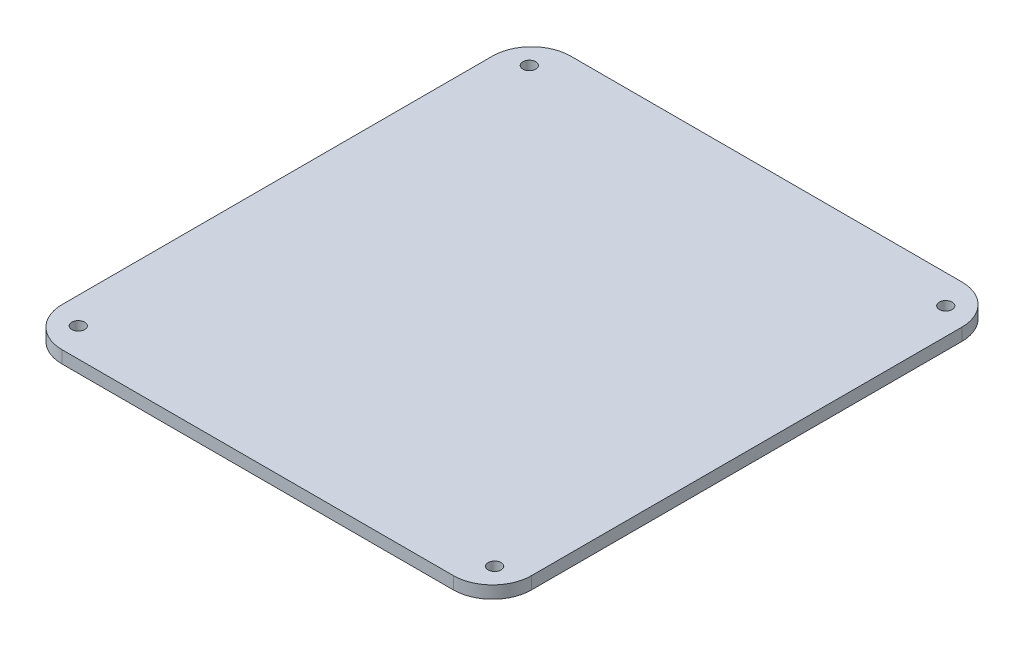
ISO-10303-21;
HEADER;
FILE_DESCRIPTION(('STEP AP214'),'2;1');
FILE_NAME('part.step','',(''),(''),'','','');
FILE_SCHEMA(('AUTOMOTIVE_DESIGN { 1 0 10303 214 1 1 1 1 }'));
ENDSEC;
DATA;
#1=APPLICATION_CONTEXT('core data for automotive mechanical design processes');
#2=APPLICATION_PROTOCOL_DEFINITION('international standard','automotive_design',2000,#1);
#3=PRODUCT_CONTEXT('',#1,'mechanical');
#4=PRODUCT('Part','Part','',(#3));
#5=PRODUCT_RELATED_PRODUCT_CATEGORY('part','',(#4));
#6=PRODUCT_DEFINITION_FORMATION('','',#4);
#7=PRODUCT_DEFINITION_CONTEXT('part definition',#1,'design');
#8=PRODUCT_DEFINITION('design','',#6,#7);
#9=PRODUCT_DEFINITION_SHAPE('','',#8);
#10=(LENGTH_UNIT() NAMED_UNIT(*) SI_UNIT(.MILLI.,.METRE.));
#11=(NAMED_UNIT(*) PLANE_ANGLE_UNIT() SI_UNIT($,.RADIAN.));
#12=(NAMED_UNIT(*) SI_UNIT($,.STERADIAN.) SOLID_ANGLE_UNIT());
#13=UNCERTAINTY_MEASURE_WITH_UNIT(LENGTH_MEASURE(1.E-05),#10,'distance_accuracy_value','');
#14=(GEOMETRIC_REPRESENTATION_CONTEXT(3) GLOBAL_UNCERTAINTY_ASSIGNED_CONTEXT((#13)) GLOBAL_UNIT_ASSIGNED_CONTEXT((#10,
#11,#12)) REPRESENTATION_CONTEXT('',''));
#15=CARTESIAN_POINT('',(0.,0.,0.));
#16=DIRECTION('',(0.,0.,1.));
#17=DIRECTION('',(1.,0.,0.));
#18=AXIS2_PLACEMENT_3D('',#15,#16,#17);
#19=CARTESIAN_POINT('',(60.,3.175,0.));
#20=DIRECTION('',(1.,0.,0.));
#21=DIRECTION('',(0.,0.,-1.));
#22=AXIS2_PLACEMENT_3D('',#19,#20,#21);
#23=PLANE('',#22);
#24=DIRECTION('',(0.,0.,1.));
#25=VECTOR('',#24,1.);
#26=CARTESIAN_POINT('',(60.,0.,0.));
#27=LINE('',#26,#25);
#28=CARTESIAN_POINT('',(60.,0.,-55.));
#29=VERTEX_POINT('',#28);
#30=CARTESIAN_POINT('',(60.,0.,55.));
#31=VERTEX_POINT('',#30);
#32=EDGE_CURVE('E122',#29,#31,#27,.T.);
#33=ORIENTED_EDGE('',*,*,#32,.F.);
#34=DIRECTION('',(0.,-1.,0.));
#35=VECTOR('',#34,1.);
#36=CARTESIAN_POINT('',(60.,3.175,-55.));
#37=LINE('',#36,#35);
#38=CARTESIAN_POINT('',(60.,3.175,-55.));
#39=VERTEX_POINT('',#38);
#40=EDGE_CURVE('E144',#29,#39,#37,.F.);
#41=ORIENTED_EDGE('',*,*,#40,.T.);
#42=DIRECTION('',(0.,0.,1.));
#43=VECTOR('',#42,1.);
#44=CARTESIAN_POINT('',(60.,3.175,0.));
#45=LINE('',#44,#43);
#46=CARTESIAN_POINT('',(60.,3.175,55.));
#47=VERTEX_POINT('',#46);
#48=EDGE_CURVE('E163',#39,#47,#45,.T.);
#49=ORIENTED_EDGE('',*,*,#48,.T.);
#50=DIRECTION('',(0.,-1.,0.));
#51=VECTOR('',#50,1.);
#52=CARTESIAN_POINT('',(60.,0.,55.));
#53=LINE('',#52,#51);
#54=EDGE_CURVE('E141',#47,#31,#53,.T.);
#55=ORIENTED_EDGE('',*,*,#54,.T.);
#56=EDGE_LOOP('',(#33,#41,#49,#55));
#57=FACE_BOUND('',#56,.T.);
#58=ADVANCED_FACE('F35',(#57),#23,.T.);
#59=CARTESIAN_POINT('',(0.,3.175,-65.));
#60=DIRECTION('',(0.,0.,-1.));
#61=DIRECTION('',(-1.,0.,0.));
#62=AXIS2_PLACEMENT_3D('',#59,#60,#61);
#63=PLANE('',#62);
#64=DIRECTION('',(1.,0.,0.));
#65=VECTOR('',#64,1.);
#66=CARTESIAN_POINT('',(0.,3.175,-65.));
#67=LINE('',#66,#65);
#68=CARTESIAN_POINT('',(-50.,3.175,-65.));
#69=VERTEX_POINT('',#68);
#70=CARTESIAN_POINT('',(50.,3.175,-65.));
#71=VERTEX_POINT('',#70);
#72=EDGE_CURVE('E160',#69,#71,#67,.T.);
#73=ORIENTED_EDGE('',*,*,#72,.T.);
#74=DIRECTION('',(0.,-1.,0.));
#75=VECTOR('',#74,1.);
#76=CARTESIAN_POINT('',(50.,3.175,-65.));
#77=LINE('',#76,#75);
#78=CARTESIAN_POINT('',(50.,0.,-65.));
#79=VERTEX_POINT('',#78);
#80=EDGE_CURVE('E113',#71,#79,#77,.T.);
#81=ORIENTED_EDGE('',*,*,#80,.T.);
#82=DIRECTION('',(1.,0.,0.));
#83=VECTOR('',#82,1.);
#84=CARTESIAN_POINT('',(0.,0.,-65.));
#85=LINE('',#84,#83);
#86=CARTESIAN_POINT('',(-50.,0.,-65.));
#87=VERTEX_POINT('',#86);
#88=EDGE_CURVE('E105',#87,#79,#85,.T.);
#89=ORIENTED_EDGE('',*,*,#88,.F.);
#90=DIRECTION('',(0.,-1.,0.));
#91=VECTOR('',#90,1.);
#92=CARTESIAN_POINT('',(-50.,3.175,-65.));
#93=LINE('',#92,#91);
#94=EDGE_CURVE('E119',#87,#69,#93,.F.);
#95=ORIENTED_EDGE('',*,*,#94,.T.);
#96=EDGE_LOOP('',(#73,#81,#89,#95));
#97=FACE_BOUND('',#96,.T.);
#98=ADVANCED_FACE('F118',(#97),#63,.T.);
#99=CARTESIAN_POINT('',(-60.,3.175,0.));
#100=DIRECTION('',(1.,0.,0.));
#101=DIRECTION('',(0.,0.,-1.));
#102=AXIS2_PLACEMENT_3D('',#99,#100,#101);
#103=PLANE('',#102);
#104=DIRECTION('',(0.,0.,1.));
#105=VECTOR('',#104,1.);
#106=CARTESIAN_POINT('',(-60.,0.,0.));
#107=LINE('',#106,#105);
#108=CARTESIAN_POINT('',(-60.,0.,-55.));
#109=VERTEX_POINT('',#108);
#110=CARTESIAN_POINT('',(-60.,0.,55.));
#111=VERTEX_POINT('',#110);
#112=EDGE_CURVE('E107',#109,#111,#107,.T.);
#113=ORIENTED_EDGE('',*,*,#112,.T.);
#114=DIRECTION('',(0.,-1.,0.));
#115=VECTOR('',#114,1.);
#116=CARTESIAN_POINT('',(-60.,3.175,55.));
#117=LINE('',#116,#115);
#118=CARTESIAN_POINT('',(-60.,3.175,55.));
#119=VERTEX_POINT('',#118);
#120=EDGE_CURVE('E11',#111,#119,#117,.F.);
#121=ORIENTED_EDGE('',*,*,#120,.T.);
#122=DIRECTION('',(0.,0.,1.));
#123=VECTOR('',#122,1.);
#124=CARTESIAN_POINT('',(-60.,3.175,0.));
#125=LINE('',#124,#123);
#126=CARTESIAN_POINT('',(-60.,3.175,-55.));
#127=VERTEX_POINT('',#126);
#128=EDGE_CURVE('E159',#127,#119,#125,.T.);
#129=ORIENTED_EDGE('',*,*,#128,.F.);
#130=DIRECTION('',(0.,-1.,0.));
#131=VECTOR('',#130,1.);
#132=CARTESIAN_POINT('',(-60.,0.,-55.));
#133=LINE('',#132,#131);
#134=EDGE_CURVE('E43',#127,#109,#133,.T.);
#135=ORIENTED_EDGE('',*,*,#134,.T.);
#136=EDGE_LOOP('',(#113,#121,#129,#135));
#137=FACE_BOUND('',#136,.T.);
#138=ADVANCED_FACE('F157',(#137),#103,.F.);
#139=CARTESIAN_POINT('',(0.,3.175,65.));
#140=DIRECTION('',(0.,0.,-1.));
#141=DIRECTION('',(-1.,0.,0.));
#142=AXIS2_PLACEMENT_3D('',#139,#140,#141);
#143=PLANE('',#142);
#144=DIRECTION('',(1.,0.,0.));
#145=VECTOR('',#144,1.);
#146=CARTESIAN_POINT('',(0.,0.,65.));
#147=LINE('',#146,#145);
#148=CARTESIAN_POINT('',(-50.,0.,65.));
#149=VERTEX_POINT('',#148);
#150=CARTESIAN_POINT('',(50.,0.,65.));
#151=VERTEX_POINT('',#150);
#152=EDGE_CURVE('E178',#149,#151,#147,.T.);
#153=ORIENTED_EDGE('',*,*,#152,.T.);
#154=DIRECTION('',(0.,-1.,0.));
#155=VECTOR('',#154,1.);
#156=CARTESIAN_POINT('',(50.,3.175,65.));
#157=LINE('',#156,#155);
#158=CARTESIAN_POINT('',(50.,3.175,65.));
#159=VERTEX_POINT('',#158);
#160=EDGE_CURVE('E50',#151,#159,#157,.F.);
#161=ORIENTED_EDGE('',*,*,#160,.T.);
#162=DIRECTION('',(1.,0.,0.));
#163=VECTOR('',#162,1.);
#164=CARTESIAN_POINT('',(0.,3.175,65.));
#165=LINE('',#164,#163);
#166=CARTESIAN_POINT('',(-50.,3.175,65.));
#167=VERTEX_POINT('',#166);
#168=EDGE_CURVE('E130',#167,#159,#165,.T.);
#169=ORIENTED_EDGE('',*,*,#168,.F.);
#170=DIRECTION('',(0.,-1.,0.));
#171=VECTOR('',#170,1.);
#172=CARTESIAN_POINT('',(-50.,3.175,65.));
#173=LINE('',#172,#171);
#174=EDGE_CURVE('E152',#167,#149,#173,.T.);
#175=ORIENTED_EDGE('',*,*,#174,.T.);
#176=EDGE_LOOP('',(#153,#161,#169,#175));
#177=FACE_BOUND('',#176,.T.);
#178=ADVANCED_FACE('F235',(#177),#143,.F.);
#179=CARTESIAN_POINT('',(53.2171989726694,3.175,57.6519655537251));
#180=DIRECTION('',(0.,-1.,0.));
#181=DIRECTION('',(0.,0.,-1.));
#182=AXIS2_PLACEMENT_3D('',#179,#180,#181);
#183=CYLINDRICAL_SURFACE('',#182,1.65);
#184=CARTESIAN_POINT('',(53.2171989726694,3.175,57.6519655537251));
#185=DIRECTION('',(0.,1.,0.));
#186=DIRECTION('',(0.,0.,1.));
#187=AXIS2_PLACEMENT_3D('',#184,#185,#186);
#188=CIRCLE('',#187,1.65);
#189=CARTESIAN_POINT('',(53.2171989726694,3.175,59.3019655537251));
#190=VERTEX_POINT('',#189);
#191=EDGE_CURVE('E190',#190,#190,#188,.T.);
#192=ORIENTED_EDGE('',*,*,#191,.T.);
#193=EDGE_LOOP('',(#192));
#194=FACE_BOUND('',#193,.T.);
#195=CARTESIAN_POINT('',(53.2171989726694,0.,57.6519655537251));
#196=DIRECTION('',(0.,1.,0.));
#197=DIRECTION('',(0.,0.,1.));
#198=AXIS2_PLACEMENT_3D('',#195,#196,#197);
#199=CIRCLE('',#198,1.65);
#200=CARTESIAN_POINT('',(53.2171989726694,0.,59.3019655537251));
#201=VERTEX_POINT('',#200);
#202=EDGE_CURVE('E173',#201,#201,#199,.T.);
#203=ORIENTED_EDGE('',*,*,#202,.F.);
#204=EDGE_LOOP('',(#203));
#205=FACE_BOUND('',#204,.T.);
#206=ADVANCED_FACE('F232',(#194,#205),#183,.F.);
#207=CARTESIAN_POINT('',(53.2171989726694,3.175,-57.6519655537251));
#208=DIRECTION('',(0.,-1.,0.));
#209=DIRECTION('',(0.,0.,-1.));
#210=AXIS2_PLACEMENT_3D('',#207,#208,#209);
#211=CYLINDRICAL_SURFACE('',#210,1.65);
#212=CARTESIAN_POINT('',(53.2171989726694,3.175,-57.6519655537251));
#213=DIRECTION('',(0.,1.,0.));
#214=DIRECTION('',(0.,0.,1.));
#215=AXIS2_PLACEMENT_3D('',#212,#213,#214);
#216=CIRCLE('',#215,1.65);
#217=CARTESIAN_POINT('',(53.2171989726694,3.175,-56.0019655537251));
#218=VERTEX_POINT('',#217);
#219=EDGE_CURVE('E185',#218,#218,#216,.F.);
#220=ORIENTED_EDGE('',*,*,#219,.F.);
#221=EDGE_LOOP('',(#220));
#222=FACE_BOUND('',#221,.T.);
#223=CARTESIAN_POINT('',(53.2171989726694,0.,-57.6519655537251));
#224=DIRECTION('',(0.,1.,0.));
#225=DIRECTION('',(0.,0.,1.));
#226=AXIS2_PLACEMENT_3D('',#223,#224,#225);
#227=CIRCLE('',#226,1.65);
#228=CARTESIAN_POINT('',(53.2171989726694,0.,-56.0019655537251));
#229=VERTEX_POINT('',#228);
#230=EDGE_CURVE('E170',#229,#229,#227,.F.);
#231=ORIENTED_EDGE('',*,*,#230,.T.);
#232=EDGE_LOOP('',(#231));
#233=FACE_BOUND('',#232,.T.);
#234=ADVANCED_FACE('F220',(#222,#233),#211,.F.);
#235=CARTESIAN_POINT('',(-53.2171989726694,3.175,-57.6519655537251));
#236=DIRECTION('',(0.,-1.,0.));
#237=DIRECTION('',(0.,0.,-1.));
#238=AXIS2_PLACEMENT_3D('',#235,#236,#237);
#239=CYLINDRICAL_SURFACE('',#238,1.65);
#240=CARTESIAN_POINT('',(-53.2171989726694,3.175,-57.6519655537251));
#241=DIRECTION('',(0.,1.,0.));
#242=DIRECTION('',(0.,0.,1.));
#243=AXIS2_PLACEMENT_3D('',#240,#241,#242);
#244=CIRCLE('',#243,1.65);
#245=CARTESIAN_POINT('',(-53.2171989726694,3.175,-56.0019655537251));
#246=VERTEX_POINT('',#245);
#247=EDGE_CURVE('E181',#246,#246,#244,.T.);
#248=ORIENTED_EDGE('',*,*,#247,.T.);
#249=EDGE_LOOP('',(#248));
#250=FACE_BOUND('',#249,.T.);
#251=CARTESIAN_POINT('',(-53.2171989726694,0.,-57.6519655537251));
#252=DIRECTION('',(0.,1.,0.));
#253=DIRECTION('',(0.,0.,1.));
#254=AXIS2_PLACEMENT_3D('',#251,#252,#253);
#255=CIRCLE('',#254,1.65);
#256=CARTESIAN_POINT('',(-53.2171989726694,0.,-56.0019655537251));
#257=VERTEX_POINT('',#256);
#258=EDGE_CURVE('E167',#257,#257,#255,.T.);
#259=ORIENTED_EDGE('',*,*,#258,.F.);
#260=EDGE_LOOP('',(#259));
#261=FACE_BOUND('',#260,.T.);
#262=ADVANCED_FACE('F215',(#250,#261),#239,.F.);
#263=CARTESIAN_POINT('',(-53.2171989726694,3.175,57.6519655537251));
#264=DIRECTION('',(0.,-1.,0.));
#265=DIRECTION('',(0.,0.,-1.));
#266=AXIS2_PLACEMENT_3D('',#263,#264,#265);
#267=CYLINDRICAL_SURFACE('',#266,1.65);
#268=CARTESIAN_POINT('',(-53.2171989726694,3.175,57.6519655537251));
#269=DIRECTION('',(0.,1.,0.));
#270=DIRECTION('',(0.,0.,1.));
#271=AXIS2_PLACEMENT_3D('',#268,#269,#270);
#272=CIRCLE('',#271,1.65);
#273=CARTESIAN_POINT('',(-53.2171989726694,3.175,59.3019655537251));
#274=VERTEX_POINT('',#273);
#275=EDGE_CURVE('E126',#274,#274,#272,.F.);
#276=ORIENTED_EDGE('',*,*,#275,.F.);
#277=EDGE_LOOP('',(#276));
#278=FACE_BOUND('',#277,.T.);
#279=CARTESIAN_POINT('',(-53.2171989726694,0.,57.6519655537251));
#280=DIRECTION('',(0.,1.,0.));
#281=DIRECTION('',(0.,0.,1.));
#282=AXIS2_PLACEMENT_3D('',#279,#280,#281);
#283=CIRCLE('',#282,1.65);
#284=CARTESIAN_POINT('',(-53.2171989726694,0.,59.3019655537251));
#285=VERTEX_POINT('',#284);
#286=EDGE_CURVE('E133',#285,#285,#283,.F.);
#287=ORIENTED_EDGE('',*,*,#286,.T.);
#288=EDGE_LOOP('',(#287));
#289=FACE_BOUND('',#288,.T.);
#290=ADVANCED_FACE('F209',(#278,#289),#267,.F.);
#291=CARTESIAN_POINT('',(0.,3.175,0.));
#292=DIRECTION('',(0.,1.,0.));
#293=DIRECTION('',(0.,0.,1.));
#294=AXIS2_PLACEMENT_3D('',#291,#292,#293);
#295=PLANE('',#294);
#296=ORIENTED_EDGE('',*,*,#247,.F.);
#297=EDGE_LOOP('',(#296));
#298=FACE_BOUND('',#297,.T.);
#299=ORIENTED_EDGE('',*,*,#219,.T.);
#300=EDGE_LOOP('',(#299));
#301=FACE_BOUND('',#300,.T.);
#302=ORIENTED_EDGE('',*,*,#191,.F.);
#303=EDGE_LOOP('',(#302));
#304=FACE_BOUND('',#303,.T.);
#305=ORIENTED_EDGE('',*,*,#48,.F.);
#306=CARTESIAN_POINT('',(50.,3.175,-55.));
#307=DIRECTION('',(0.,1.,0.));
#308=DIRECTION('',(0.,0.,1.));
#309=AXIS2_PLACEMENT_3D('',#306,#307,#308);
#310=CIRCLE('',#309,10.);
#311=EDGE_CURVE('E150',#39,#71,#310,.T.);
#312=ORIENTED_EDGE('',*,*,#311,.T.);
#313=ORIENTED_EDGE('',*,*,#72,.F.);
#314=CARTESIAN_POINT('',(-50.,3.175,-55.));
#315=DIRECTION('',(0.,1.,0.));
#316=DIRECTION('',(0.,0.,1.));
#317=AXIS2_PLACEMENT_3D('',#314,#315,#316);
#318=CIRCLE('',#317,10.);
#319=EDGE_CURVE('E125',#69,#127,#318,.T.);
#320=ORIENTED_EDGE('',*,*,#319,.T.);
#321=ORIENTED_EDGE('',*,*,#128,.T.);
#322=CARTESIAN_POINT('',(-50.,3.175,55.));
#323=DIRECTION('',(0.,1.,0.));
#324=DIRECTION('',(0.,0.,1.));
#325=AXIS2_PLACEMENT_3D('',#322,#323,#324);
#326=CIRCLE('',#325,10.);
#327=EDGE_CURVE('E57',#119,#167,#326,.T.);
#328=ORIENTED_EDGE('',*,*,#327,.T.);
#329=ORIENTED_EDGE('',*,*,#168,.T.);
#330=CARTESIAN_POINT('',(50.,3.175,55.));
#331=DIRECTION('',(0.,1.,0.));
#332=DIRECTION('',(0.,0.,1.));
#333=AXIS2_PLACEMENT_3D('',#330,#331,#332);
#334=CIRCLE('',#333,10.);
#335=EDGE_CURVE('E148',#159,#47,#334,.T.);
#336=ORIENTED_EDGE('',*,*,#335,.T.);
#337=EDGE_LOOP('',(#305,#312,#313,#320,#321,#328,#329,#336));
#338=FACE_BOUND('',#337,.T.);
#339=ORIENTED_EDGE('',*,*,#275,.T.);
#340=EDGE_LOOP('',(#339));
#341=FACE_BOUND('',#340,.T.);
#342=ADVANCED_FACE('F206',(#298,#301,#304,#338,#341),#295,.T.);
#343=CARTESIAN_POINT('',(0.,0.,0.));
#344=DIRECTION('',(0.,1.,0.));
#345=DIRECTION('',(0.,0.,1.));
#346=AXIS2_PLACEMENT_3D('',#343,#344,#345);
#347=PLANE('',#346);
#348=ORIENTED_EDGE('',*,*,#258,.T.);
#349=EDGE_LOOP('',(#348));
#350=FACE_BOUND('',#349,.T.);
#351=ORIENTED_EDGE('',*,*,#230,.F.);
#352=EDGE_LOOP('',(#351));
#353=FACE_BOUND('',#352,.T.);
#354=ORIENTED_EDGE('',*,*,#202,.T.);
#355=EDGE_LOOP('',(#354));
#356=FACE_BOUND('',#355,.T.);
#357=ORIENTED_EDGE('',*,*,#88,.T.);
#358=CARTESIAN_POINT('',(50.,0.,-55.));
#359=DIRECTION('',(0.,1.,0.));
#360=DIRECTION('',(0.,0.,1.));
#361=AXIS2_PLACEMENT_3D('',#358,#359,#360);
#362=CIRCLE('',#361,10.);
#363=EDGE_CURVE('E139',#79,#29,#362,.F.);
#364=ORIENTED_EDGE('',*,*,#363,.T.);
#365=ORIENTED_EDGE('',*,*,#32,.T.);
#366=CARTESIAN_POINT('',(50.,0.,55.));
#367=DIRECTION('',(0.,1.,0.));
#368=DIRECTION('',(0.,0.,1.));
#369=AXIS2_PLACEMENT_3D('',#366,#367,#368);
#370=CIRCLE('',#369,10.);
#371=EDGE_CURVE('E137',#31,#151,#370,.F.);
#372=ORIENTED_EDGE('',*,*,#371,.T.);
#373=ORIENTED_EDGE('',*,*,#152,.F.);
#374=CARTESIAN_POINT('',(-50.,0.,55.));
#375=DIRECTION('',(0.,1.,0.));
#376=DIRECTION('',(0.,0.,1.));
#377=AXIS2_PLACEMENT_3D('',#374,#375,#376);
#378=CIRCLE('',#377,10.);
#379=EDGE_CURVE('E112',#149,#111,#378,.F.);
#380=ORIENTED_EDGE('',*,*,#379,.T.);
#381=ORIENTED_EDGE('',*,*,#112,.F.);
#382=CARTESIAN_POINT('',(-50.,0.,-55.));
#383=DIRECTION('',(0.,1.,0.));
#384=DIRECTION('',(0.,0.,1.));
#385=AXIS2_PLACEMENT_3D('',#382,#383,#384);
#386=CIRCLE('',#385,10.);
#387=EDGE_CURVE('E101',#109,#87,#386,.F.);
#388=ORIENTED_EDGE('',*,*,#387,.T.);
#389=EDGE_LOOP('',(#357,#364,#365,#372,#373,#380,#381,#388));
#390=FACE_BOUND('',#389,.T.);
#391=ORIENTED_EDGE('',*,*,#286,.F.);
#392=EDGE_LOOP('',(#391));
#393=FACE_BOUND('',#392,.T.);
#394=ADVANCED_FACE('F103',(#350,#353,#356,#390,#393),#347,.F.);
#395=CARTESIAN_POINT('',(50.,3.175,-55.));
#396=DIRECTION('',(0.,-1.,0.));
#397=DIRECTION('',(0.,0.,-1.));
#398=AXIS2_PLACEMENT_3D('',#395,#396,#397);
#399=CYLINDRICAL_SURFACE('',#398,10.);
#400=ORIENTED_EDGE('',*,*,#311,.F.);
#401=ORIENTED_EDGE('',*,*,#40,.F.);
#402=ORIENTED_EDGE('',*,*,#363,.F.);
#403=ORIENTED_EDGE('',*,*,#80,.F.);
#404=EDGE_LOOP('',(#400,#401,#402,#403));
#405=FACE_BOUND('',#404,.T.);
#406=ADVANCED_FACE('F205',(#405),#399,.T.);
#407=CARTESIAN_POINT('',(50.,3.175,55.));
#408=DIRECTION('',(0.,1.,0.));
#409=DIRECTION('',(0.,0.,1.));
#410=AXIS2_PLACEMENT_3D('',#407,#408,#409);
#411=CYLINDRICAL_SURFACE('',#410,10.);
#412=ORIENTED_EDGE('',*,*,#335,.F.);
#413=ORIENTED_EDGE('',*,*,#160,.F.);
#414=ORIENTED_EDGE('',*,*,#371,.F.);
#415=ORIENTED_EDGE('',*,*,#54,.F.);
#416=EDGE_LOOP('',(#412,#413,#414,#415));
#417=FACE_BOUND('',#416,.T.);
#418=ADVANCED_FACE('F203',(#417),#411,.T.);
#419=CARTESIAN_POINT('',(-50.,3.175,55.));
#420=DIRECTION('',(0.,-1.,0.));
#421=DIRECTION('',(0.,0.,-1.));
#422=AXIS2_PLACEMENT_3D('',#419,#420,#421);
#423=CYLINDRICAL_SURFACE('',#422,10.);
#424=ORIENTED_EDGE('',*,*,#327,.F.);
#425=ORIENTED_EDGE('',*,*,#120,.F.);
#426=ORIENTED_EDGE('',*,*,#379,.F.);
#427=ORIENTED_EDGE('',*,*,#174,.F.);
#428=EDGE_LOOP('',(#424,#425,#426,#427));
#429=FACE_BOUND('',#428,.T.);
#430=ADVANCED_FACE('F243',(#429),#423,.T.);
#431=CARTESIAN_POINT('',(-50.,3.175,-55.));
#432=DIRECTION('',(0.,1.,0.));
#433=DIRECTION('',(0.,0.,1.));
#434=AXIS2_PLACEMENT_3D('',#431,#432,#433);
#435=CYLINDRICAL_SURFACE('',#434,10.);
#436=ORIENTED_EDGE('',*,*,#319,.F.);
#437=ORIENTED_EDGE('',*,*,#94,.F.);
#438=ORIENTED_EDGE('',*,*,#387,.F.);
#439=ORIENTED_EDGE('',*,*,#134,.F.);
#440=EDGE_LOOP('',(#436,#437,#438,#439));
#441=FACE_BOUND('',#440,.T.);
#442=ADVANCED_FACE('F37',(#441),#435,.T.);
#443=CLOSED_SHELL('',(#58,#98,#138,#178,#206,#234,#262,#290,#342,#394,#406,#418,#430,#442));
#444=MANIFOLD_SOLID_BREP('B2',#443);
#445=ADVANCED_BREP_SHAPE_REPRESENTATION('',(#18,#444),#14);
#446=SHAPE_DEFINITION_REPRESENTATION(#9,#445);
ENDSEC;
END-ISO-10303-21;
